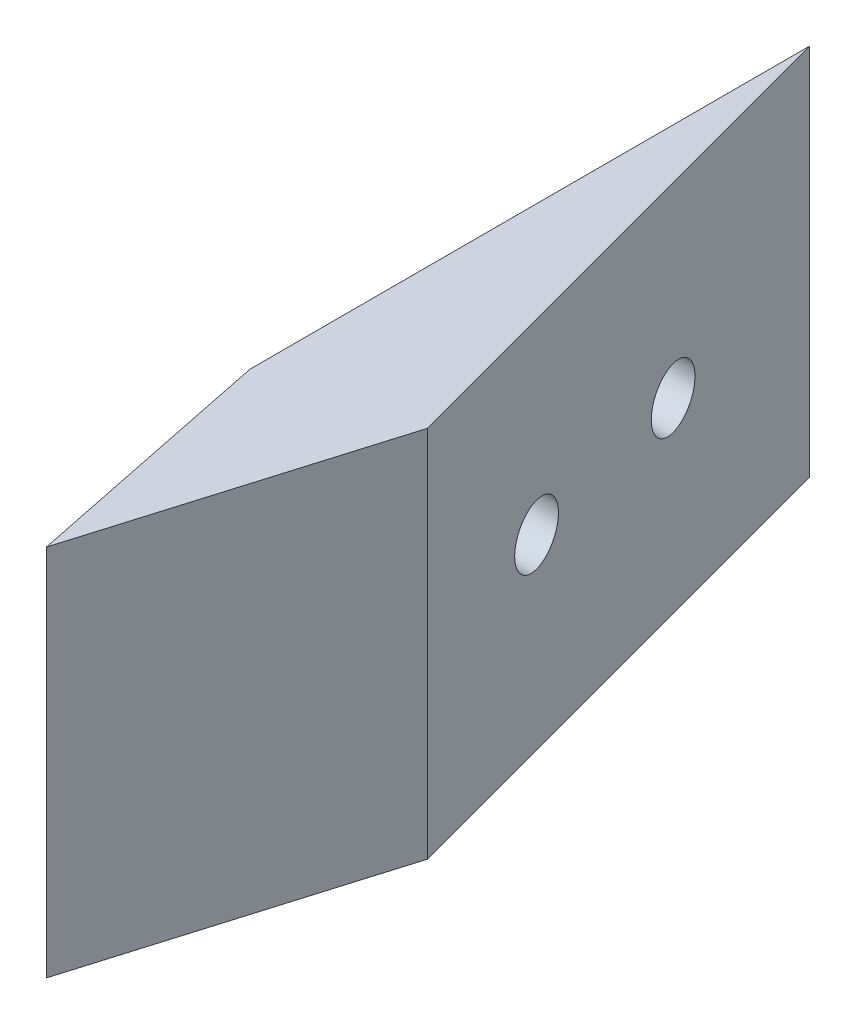
ISO-10303-21;
HEADER;
FILE_DESCRIPTION(('STEP AP214'),'2;1');
FILE_NAME('part.step','',(''),(''),'','','');
FILE_SCHEMA(('AUTOMOTIVE_DESIGN { 1 0 10303 214 1 1 1 1 }'));
ENDSEC;
DATA;
#1=APPLICATION_CONTEXT('core data for automotive mechanical design processes');
#2=APPLICATION_PROTOCOL_DEFINITION('international standard','automotive_design',2000,#1);
#3=PRODUCT_CONTEXT('',#1,'mechanical');
#4=PRODUCT('Part','Part','',(#3));
#5=PRODUCT_RELATED_PRODUCT_CATEGORY('part','',(#4));
#6=PRODUCT_DEFINITION_FORMATION('','',#4);
#7=PRODUCT_DEFINITION_CONTEXT('part definition',#1,'design');
#8=PRODUCT_DEFINITION('design','',#6,#7);
#9=PRODUCT_DEFINITION_SHAPE('','',#8);
#10=(LENGTH_UNIT() NAMED_UNIT(*) SI_UNIT(.MILLI.,.METRE.));
#11=(NAMED_UNIT(*) PLANE_ANGLE_UNIT() SI_UNIT($,.RADIAN.));
#12=(NAMED_UNIT(*) SI_UNIT($,.STERADIAN.) SOLID_ANGLE_UNIT());
#13=UNCERTAINTY_MEASURE_WITH_UNIT(LENGTH_MEASURE(1.E-05),#10,'distance_accuracy_value','');
#14=(GEOMETRIC_REPRESENTATION_CONTEXT(3) GLOBAL_UNCERTAINTY_ASSIGNED_CONTEXT((#13)) GLOBAL_UNIT_ASSIGNED_CONTEXT((#10,
#11,#12)) REPRESENTATION_CONTEXT('',''));
#15=CARTESIAN_POINT('',(0.,0.,0.));
#16=DIRECTION('',(0.,0.,1.));
#17=DIRECTION('',(1.,0.,0.));
#18=AXIS2_PLACEMENT_3D('',#15,#16,#17);
#19=CARTESIAN_POINT('',(-2.5,10.,0.));
#20=DIRECTION('',(1.,0.,0.));
#21=DIRECTION('',(0.,0.,-1.));
#22=AXIS2_PLACEMENT_3D('',#19,#20,#21);
#23=PLANE('',#22);
#24=CARTESIAN_POINT('',(-2.5,5.,5.));
#25=DIRECTION('',(-1.,0.,0.));
#26=DIRECTION('',(0.,0.,1.));
#27=AXIS2_PLACEMENT_3D('',#24,#25,#26);
#28=CIRCLE('',#27,0.800000000000001);
#29=CARTESIAN_POINT('',(-2.5,5.,5.8));
#30=VERTEX_POINT('',#29);
#31=EDGE_CURVE('E104',#30,#30,#28,.T.);
#32=ORIENTED_EDGE('',*,*,#31,.F.);
#33=EDGE_LOOP('',(#32));
#34=FACE_BOUND('',#33,.T.);
#35=CARTESIAN_POINT('',(-2.5,5.,9.99999999999935));
#36=DIRECTION('',(-1.,0.,0.));
#37=DIRECTION('',(0.,0.,1.));
#38=AXIS2_PLACEMENT_3D('',#35,#36,#37);
#39=CIRCLE('',#38,0.800000000000001);
#40=CARTESIAN_POINT('',(-2.5,5.,10.7999999999994));
#41=VERTEX_POINT('',#40);
#42=EDGE_CURVE('E109',#41,#41,#39,.T.);
#43=ORIENTED_EDGE('',*,*,#42,.F.);
#44=EDGE_LOOP('',(#43));
#45=FACE_BOUND('',#44,.T.);
#46=DIRECTION('',(0.,1.,0.));
#47=VECTOR('',#46,1.);
#48=CARTESIAN_POINT('',(-2.5,0.,14.9999999999994));
#49=LINE('',#48,#47);
#50=CARTESIAN_POINT('',(-2.5,0.,14.9999999999994));
#51=VERTEX_POINT('',#50);
#52=CARTESIAN_POINT('',(-2.5,10.,14.9999999999994));
#53=VERTEX_POINT('',#52);
#54=EDGE_CURVE('E81',#51,#53,#49,.T.);
#55=ORIENTED_EDGE('',*,*,#54,.T.);
#56=DIRECTION('',(0.,0.,1.));
#57=VECTOR('',#56,1.);
#58=CARTESIAN_POINT('',(-2.5,10.,0.));
#59=LINE('',#58,#57);
#60=CARTESIAN_POINT('',(-2.5,10.,0.));
#61=VERTEX_POINT('',#60);
#62=EDGE_CURVE('E47',#61,#53,#59,.T.);
#63=ORIENTED_EDGE('',*,*,#62,.F.);
#64=DIRECTION('',(0.,-1.,0.));
#65=VECTOR('',#64,1.);
#66=CARTESIAN_POINT('',(-2.5,10.,0.));
#67=LINE('',#66,#65);
#68=CARTESIAN_POINT('',(-2.5,0.,0.));
#69=VERTEX_POINT('',#68);
#70=EDGE_CURVE('E11',#61,#69,#67,.T.);
#71=ORIENTED_EDGE('',*,*,#70,.T.);
#72=DIRECTION('',(0.,0.,1.));
#73=VECTOR('',#72,1.);
#74=CARTESIAN_POINT('',(-2.5,0.,0.));
#75=LINE('',#74,#73);
#76=EDGE_CURVE('E95',#69,#51,#75,.T.);
#77=ORIENTED_EDGE('',*,*,#76,.T.);
#78=EDGE_LOOP('',(#55,#63,#71,#77));
#79=FACE_BOUND('',#78,.T.);
#80=ADVANCED_FACE('F39',(#34,#45,#79),#23,.F.);
#81=CARTESIAN_POINT('',(0.,10.,0.));
#82=DIRECTION('',(0.,1.,0.));
#83=DIRECTION('',(0.,0.,1.));
#84=AXIS2_PLACEMENT_3D('',#81,#82,#83);
#85=PLANE('',#84);
#86=ORIENTED_EDGE('',*,*,#62,.T.);
#87=DIRECTION('',(0.2,0.,0.979795897113271));
#88=VECTOR('',#87,1.);
#89=CARTESIAN_POINT('',(-5.33938769133969,10.,1.08989794855661));
#90=LINE('',#89,#88);
#91=CARTESIAN_POINT('',(-1.1,10.,21.8585712797923));
#92=VERTEX_POINT('',#91);
#93=EDGE_CURVE('E84',#53,#92,#90,.T.);
#94=ORIENTED_EDGE('',*,*,#93,.T.);
#95=DIRECTION('',(-0.286340061565386,0.,0.958128054668441));
#96=VECTOR('',#95,1.);
#97=CARTESIAN_POINT('',(4.98709847700225,10.,1.49041255809134));
#98=LINE('',#97,#96);
#99=CARTESIAN_POINT('',(1.24999999999985,10.,13.9951905283827));
#100=VERTEX_POINT('',#99);
#101=EDGE_CURVE('E97',#100,#92,#98,.T.);
#102=ORIENTED_EDGE('',*,*,#101,.F.);
#103=DIRECTION('',(0.258819045102521,0.,0.965925826289068));
#104=VECTOR('',#103,1.);
#105=CARTESIAN_POINT('',(-2.33253175473055,10.,0.625000000000001));
#106=LINE('',#105,#104);
#107=EDGE_CURVE('E119',#61,#100,#106,.T.);
#108=ORIENTED_EDGE('',*,*,#107,.F.);
#109=EDGE_LOOP('',(#86,#94,#102,#108));
#110=FACE_BOUND('',#109,.T.);
#111=ADVANCED_FACE('F129',(#110),#85,.T.);
#112=CARTESIAN_POINT('',(0.,0.,0.));
#113=DIRECTION('',(0.,1.,0.));
#114=DIRECTION('',(0.,0.,1.));
#115=AXIS2_PLACEMENT_3D('',#112,#113,#114);
#116=PLANE('',#115);
#117=DIRECTION('',(0.2,0.,0.979795897113271));
#118=VECTOR('',#117,1.);
#119=CARTESIAN_POINT('',(-5.33938769133969,0.,1.08989794855661));
#120=LINE('',#119,#118);
#121=CARTESIAN_POINT('',(-1.1,0.,21.8585712797923));
#122=VERTEX_POINT('',#121);
#123=EDGE_CURVE('E64',#51,#122,#120,.T.);
#124=ORIENTED_EDGE('',*,*,#123,.F.);
#125=ORIENTED_EDGE('',*,*,#76,.F.);
#126=DIRECTION('',(0.258819045102521,0.,0.965925826289068));
#127=VECTOR('',#126,1.);
#128=CARTESIAN_POINT('',(-2.33253175473055,0.,0.625000000000001));
#129=LINE('',#128,#127);
#130=CARTESIAN_POINT('',(1.24999999999985,0.,13.9951905283827));
#131=VERTEX_POINT('',#130);
#132=EDGE_CURVE('E96',#69,#131,#129,.T.);
#133=ORIENTED_EDGE('',*,*,#132,.T.);
#134=DIRECTION('',(-0.286340061565386,0.,0.958128054668441));
#135=VECTOR('',#134,1.);
#136=CARTESIAN_POINT('',(4.98709847700225,0.,1.49041255809134));
#137=LINE('',#136,#135);
#138=EDGE_CURVE('E55',#131,#122,#137,.T.);
#139=ORIENTED_EDGE('',*,*,#138,.T.);
#140=EDGE_LOOP('',(#124,#125,#133,#139));
#141=FACE_BOUND('',#140,.T.);
#142=ADVANCED_FACE('F93',(#141),#116,.F.);
#143=CARTESIAN_POINT('',(-5.33938769133969,0.,1.08989794855661));
#144=DIRECTION('',(-0.979795897113271,0.,0.2));
#145=DIRECTION('',(0.2,0.,0.979795897113271));
#146=AXIS2_PLACEMENT_3D('',#143,#144,#145);
#147=PLANE('',#146);
#148=ORIENTED_EDGE('',*,*,#93,.F.);
#149=ORIENTED_EDGE('',*,*,#54,.F.);
#150=ORIENTED_EDGE('',*,*,#123,.T.);
#151=DIRECTION('',(0.,1.,0.));
#152=VECTOR('',#151,1.);
#153=CARTESIAN_POINT('',(-1.1,0.,21.8585712797923));
#154=LINE('',#153,#152);
#155=EDGE_CURVE('E78',#122,#92,#154,.T.);
#156=ORIENTED_EDGE('',*,*,#155,.T.);
#157=EDGE_LOOP('',(#148,#149,#150,#156));
#158=FACE_BOUND('',#157,.T.);
#159=ADVANCED_FACE('F82',(#158),#147,.T.);
#160=CARTESIAN_POINT('',(4.98709847700225,0.,1.49041255809134));
#161=DIRECTION('',(-0.958128054668441,0.,-0.286340061565386));
#162=DIRECTION('',(-0.286340061565386,0.,0.958128054668441));
#163=AXIS2_PLACEMENT_3D('',#160,#161,#162);
#164=PLANE('',#163);
#165=ORIENTED_EDGE('',*,*,#101,.T.);
#166=ORIENTED_EDGE('',*,*,#155,.F.);
#167=ORIENTED_EDGE('',*,*,#138,.F.);
#168=DIRECTION('',(0.,1.,0.));
#169=VECTOR('',#168,1.);
#170=CARTESIAN_POINT('',(1.24999999999985,0.,13.9951905283827));
#171=LINE('',#170,#169);
#172=EDGE_CURVE('E89',#131,#100,#171,.T.);
#173=ORIENTED_EDGE('',*,*,#172,.T.);
#174=EDGE_LOOP('',(#165,#166,#167,#173));
#175=FACE_BOUND('',#174,.T.);
#176=ADVANCED_FACE('F123',(#175),#164,.F.);
#177=CARTESIAN_POINT('',(-2.33253175473055,0.,0.625000000000001));
#178=DIRECTION('',(-0.965925826289068,0.,0.258819045102521));
#179=DIRECTION('',(0.258819045102521,0.,0.965925826289068));
#180=AXIS2_PLACEMENT_3D('',#177,#178,#179);
#181=PLANE('',#180);
#182=CARTESIAN_POINT('',(-1.16025403784438,5.,5.));
#183=DIRECTION('',(-0.965925826289068,0.,0.258819045102521));
#184=DIRECTION('',(-0.258819045102521,0.,-0.965925826289068));
#185=AXIS2_PLACEMENT_3D('',#182,#183,#184);
#186=ELLIPSE('',#185,0.828220944328067,0.800000000000001);
#187=CARTESIAN_POINT('',(-1.37461339178928,5.,4.2));
#188=VERTEX_POINT('',#187);
#189=EDGE_CURVE('E42',#188,#188,#186,.T.);
#190=ORIENTED_EDGE('',*,*,#189,.T.);
#191=EDGE_LOOP('',(#190));
#192=FACE_BOUND('',#191,.T.);
#193=CARTESIAN_POINT('',(0.179491924311061,5.,9.99999999999935));
#194=DIRECTION('',(-0.965925826289068,0.,0.258819045102521));
#195=DIRECTION('',(-0.258819045102521,0.,-0.965925826289068));
#196=AXIS2_PLACEMENT_3D('',#193,#194,#195);
#197=ELLIPSE('',#196,0.828220944328067,0.800000000000001);
#198=CARTESIAN_POINT('',(-0.0348674296338381,5.,9.19999999999935));
#199=VERTEX_POINT('',#198);
#200=EDGE_CURVE('E102',#199,#199,#197,.T.);
#201=ORIENTED_EDGE('',*,*,#200,.T.);
#202=EDGE_LOOP('',(#201));
#203=FACE_BOUND('',#202,.T.);
#204=ORIENTED_EDGE('',*,*,#107,.T.);
#205=ORIENTED_EDGE('',*,*,#172,.F.);
#206=ORIENTED_EDGE('',*,*,#132,.F.);
#207=ORIENTED_EDGE('',*,*,#70,.F.);
#208=EDGE_LOOP('',(#204,#205,#206,#207));
#209=FACE_BOUND('',#208,.T.);
#210=ADVANCED_FACE('F127',(#192,#203,#209),#181,.F.);
#211=CARTESIAN_POINT('',(1.24999999999985,5.,9.99999999999935));
#212=DIRECTION('',(-1.,0.,0.));
#213=DIRECTION('',(0.,0.,1.));
#214=AXIS2_PLACEMENT_3D('',#211,#212,#213);
#215=CYLINDRICAL_SURFACE('',#214,0.800000000000001);
#216=ORIENTED_EDGE('',*,*,#42,.T.);
#217=EDGE_LOOP('',(#216));
#218=FACE_BOUND('',#217,.T.);
#219=ORIENTED_EDGE('',*,*,#200,.F.);
#220=EDGE_LOOP('',(#219));
#221=FACE_BOUND('',#220,.T.);
#222=ADVANCED_FACE('F143',(#218,#221),#215,.F.);
#223=CARTESIAN_POINT('',(1.24999999999985,5.,5.));
#224=DIRECTION('',(-1.,0.,0.));
#225=DIRECTION('',(0.,0.,1.));
#226=AXIS2_PLACEMENT_3D('',#223,#224,#225);
#227=CYLINDRICAL_SURFACE('',#226,0.800000000000001);
#228=ORIENTED_EDGE('',*,*,#31,.T.);
#229=EDGE_LOOP('',(#228));
#230=FACE_BOUND('',#229,.T.);
#231=ORIENTED_EDGE('',*,*,#189,.F.);
#232=EDGE_LOOP('',(#231));
#233=FACE_BOUND('',#232,.T.);
#234=ADVANCED_FACE('F149',(#230,#233),#227,.F.);
#235=CLOSED_SHELL('',(#80,#111,#142,#159,#176,#210,#222,#234));
#236=MANIFOLD_SOLID_BREP('B2',#235);
#237=ADVANCED_BREP_SHAPE_REPRESENTATION('',(#18,#236),#14);
#238=SHAPE_DEFINITION_REPRESENTATION(#9,#237);
ENDSEC;
END-ISO-10303-21;
